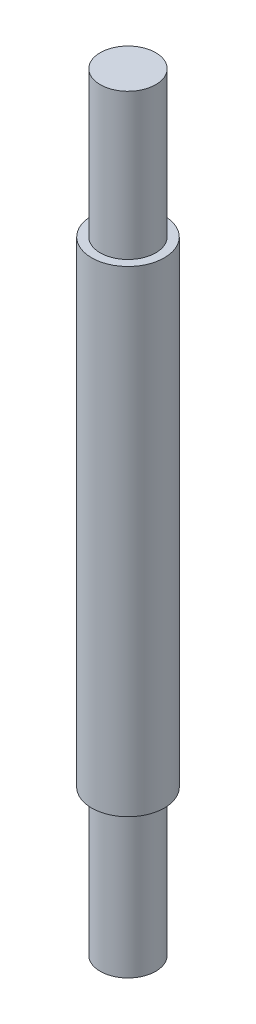
ISO-10303-21;
HEADER;
FILE_DESCRIPTION(('STEP AP214'),'2;1');
FILE_NAME('part.step','',(''),(''),'','','');
FILE_SCHEMA(('AUTOMOTIVE_DESIGN { 1 0 10303 214 1 1 1 1 }'));
ENDSEC;
DATA;
#1=APPLICATION_CONTEXT('core data for automotive mechanical design processes');
#2=APPLICATION_PROTOCOL_DEFINITION('international standard','automotive_design',2000,#1);
#3=PRODUCT_CONTEXT('',#1,'mechanical');
#4=PRODUCT('Part','Part','',(#3));
#5=PRODUCT_RELATED_PRODUCT_CATEGORY('part','',(#4));
#6=PRODUCT_DEFINITION_FORMATION('','',#4);
#7=PRODUCT_DEFINITION_CONTEXT('part definition',#1,'design');
#8=PRODUCT_DEFINITION('design','',#6,#7);
#9=PRODUCT_DEFINITION_SHAPE('','',#8);
#10=(LENGTH_UNIT() NAMED_UNIT(*) SI_UNIT(.MILLI.,.METRE.));
#11=(NAMED_UNIT(*) PLANE_ANGLE_UNIT() SI_UNIT($,.RADIAN.));
#12=(NAMED_UNIT(*) SI_UNIT($,.STERADIAN.) SOLID_ANGLE_UNIT());
#13=UNCERTAINTY_MEASURE_WITH_UNIT(LENGTH_MEASURE(1.E-05),#10,'distance_accuracy_value','');
#14=(GEOMETRIC_REPRESENTATION_CONTEXT(3) GLOBAL_UNCERTAINTY_ASSIGNED_CONTEXT((#13)) GLOBAL_UNIT_ASSIGNED_CONTEXT((#10,
#11,#12)) REPRESENTATION_CONTEXT('',''));
#15=CARTESIAN_POINT('',(0.,0.,0.));
#16=DIRECTION('',(0.,0.,1.));
#17=DIRECTION('',(1.,0.,0.));
#18=AXIS2_PLACEMENT_3D('',#15,#16,#17);
#19=CARTESIAN_POINT('',(0.,1.315,0.));
#20=DIRECTION('',(0.,-1.,0.));
#21=DIRECTION('',(0.,0.,-1.));
#22=AXIS2_PLACEMENT_3D('',#19,#20,#21);
#23=CYLINDRICAL_SURFACE('',#22,0.095);
#24=CARTESIAN_POINT('',(0.,0.816,0.));
#25=DIRECTION('',(0.,1.,0.));
#26=DIRECTION('',(0.,0.,1.));
#27=AXIS2_PLACEMENT_3D('',#24,#25,#26);
#28=CIRCLE('',#27,0.095);
#29=CARTESIAN_POINT('',(0.,0.816,0.095));
#30=VERTEX_POINT('',#29);
#31=EDGE_CURVE('E55',#30,#30,#28,.T.);
#32=ORIENTED_EDGE('',*,*,#31,.T.);
#33=EDGE_LOOP('',(#32));
#34=FACE_BOUND('',#33,.T.);
#35=CARTESIAN_POINT('',(0.,1.315,0.));
#36=DIRECTION('',(0.,1.,0.));
#37=DIRECTION('',(0.,0.,1.));
#38=AXIS2_PLACEMENT_3D('',#35,#36,#37);
#39=CIRCLE('',#38,0.095);
#40=CARTESIAN_POINT('',(0.,1.315,0.095));
#41=VERTEX_POINT('',#40);
#42=EDGE_CURVE('E41',#41,#41,#39,.T.);
#43=ORIENTED_EDGE('',*,*,#42,.F.);
#44=EDGE_LOOP('',(#43));
#45=FACE_BOUND('',#44,.T.);
#46=ADVANCED_FACE('F35',(#34,#45),#23,.T.);
#47=CARTESIAN_POINT('',(0.,1.315,0.));
#48=DIRECTION('',(0.,1.,0.));
#49=DIRECTION('',(0.,0.,1.));
#50=AXIS2_PLACEMENT_3D('',#47,#48,#49);
#51=PLANE('',#50);
#52=ORIENTED_EDGE('',*,*,#42,.T.);
#53=EDGE_LOOP('',(#52));
#54=FACE_BOUND('',#53,.T.);
#55=ADVANCED_FACE('F66',(#54),#51,.T.);
#56=CARTESIAN_POINT('',(0.,0.816,0.));
#57=DIRECTION('',(0.,1.,0.));
#58=DIRECTION('',(0.,0.,1.));
#59=AXIS2_PLACEMENT_3D('',#56,#57,#58);
#60=PLANE('',#59);
#61=CARTESIAN_POINT('',(0.,0.816,0.));
#62=DIRECTION('',(0.,1.,0.));
#63=DIRECTION('',(0.,0.,1.));
#64=AXIS2_PLACEMENT_3D('',#61,#62,#63);
#65=CIRCLE('',#64,0.124286750886411);
#66=CARTESIAN_POINT('',(0.,0.816,0.124286750886411));
#67=VERTEX_POINT('',#66);
#68=EDGE_CURVE('E50',#67,#67,#65,.T.);
#69=ORIENTED_EDGE('',*,*,#68,.T.);
#70=EDGE_LOOP('',(#69));
#71=FACE_BOUND('',#70,.T.);
#72=ORIENTED_EDGE('',*,*,#31,.F.);
#73=EDGE_LOOP('',(#72));
#74=FACE_BOUND('',#73,.T.);
#75=ADVANCED_FACE('F63',(#71,#74),#60,.T.);
#76=CARTESIAN_POINT('',(0.,-0.816,0.));
#77=DIRECTION('',(0.,1.,0.));
#78=DIRECTION('',(0.,0.,1.));
#79=AXIS2_PLACEMENT_3D('',#76,#77,#78);
#80=PLANE('',#79);
#81=CARTESIAN_POINT('',(0.,-0.816,0.));
#82=DIRECTION('',(0.,1.,0.));
#83=DIRECTION('',(0.,0.,1.));
#84=AXIS2_PLACEMENT_3D('',#81,#82,#83);
#85=CIRCLE('',#84,0.124286750886411);
#86=CARTESIAN_POINT('',(0.,-0.816,0.124286750886411));
#87=VERTEX_POINT('',#86);
#88=EDGE_CURVE('E52',#87,#87,#85,.T.);
#89=ORIENTED_EDGE('',*,*,#88,.F.);
#90=EDGE_LOOP('',(#89));
#91=FACE_BOUND('',#90,.T.);
#92=CARTESIAN_POINT('',(0.,-0.816,0.));
#93=DIRECTION('',(0.,1.,0.));
#94=DIRECTION('',(0.,0.,1.));
#95=AXIS2_PLACEMENT_3D('',#92,#93,#94);
#96=CIRCLE('',#95,0.095);
#97=CARTESIAN_POINT('',(0.,-0.816,0.095));
#98=VERTEX_POINT('',#97);
#99=EDGE_CURVE('E10',#98,#98,#96,.T.);
#100=ORIENTED_EDGE('',*,*,#99,.T.);
#101=EDGE_LOOP('',(#100));
#102=FACE_BOUND('',#101,.T.);
#103=ADVANCED_FACE('F65',(#91,#102),#80,.F.);
#104=CARTESIAN_POINT('',(0.,0.816,0.));
#105=DIRECTION('',(0.,-1.,0.));
#106=DIRECTION('',(0.,0.,-1.));
#107=AXIS2_PLACEMENT_3D('',#104,#105,#106);
#108=CYLINDRICAL_SURFACE('',#107,0.124286750886411);
#109=ORIENTED_EDGE('',*,*,#68,.F.);
#110=EDGE_LOOP('',(#109));
#111=FACE_BOUND('',#110,.T.);
#112=ORIENTED_EDGE('',*,*,#88,.T.);
#113=EDGE_LOOP('',(#112));
#114=FACE_BOUND('',#113,.T.);
#115=ADVANCED_FACE('F73',(#111,#114),#108,.T.);
#116=CARTESIAN_POINT('',(0.,-1.315,0.));
#117=DIRECTION('',(0.,1.,0.));
#118=DIRECTION('',(0.,0.,1.));
#119=AXIS2_PLACEMENT_3D('',#116,#117,#118);
#120=PLANE('',#119);
#121=CARTESIAN_POINT('',(0.,-1.315,0.));
#122=DIRECTION('',(0.,1.,0.));
#123=DIRECTION('',(0.,0.,1.));
#124=AXIS2_PLACEMENT_3D('',#121,#122,#123);
#125=CIRCLE('',#124,0.095);
#126=CARTESIAN_POINT('',(0.,-1.315,0.095));
#127=VERTEX_POINT('',#126);
#128=EDGE_CURVE('E45',#127,#127,#125,.T.);
#129=ORIENTED_EDGE('',*,*,#128,.F.);
#130=EDGE_LOOP('',(#129));
#131=FACE_BOUND('',#130,.T.);
#132=ADVANCED_FACE('F82',(#131),#120,.F.);
#133=ORIENTED_EDGE('',*,*,#128,.T.);
#134=EDGE_LOOP('',(#133));
#135=FACE_BOUND('',#134,.T.);
#136=ORIENTED_EDGE('',*,*,#99,.F.);
#137=EDGE_LOOP('',(#136));
#138=FACE_BOUND('',#137,.T.);
#139=ADVANCED_FACE('F78',(#135,#138),#23,.T.);
#140=CLOSED_SHELL('',(#46,#55,#75,#103,#115,#132,#139));
#141=MANIFOLD_SOLID_BREP('B2',#140);
#142=ADVANCED_BREP_SHAPE_REPRESENTATION('',(#18,#141),#14);
#143=SHAPE_DEFINITION_REPRESENTATION(#9,#142);
ENDSEC;
END-ISO-10303-21;
